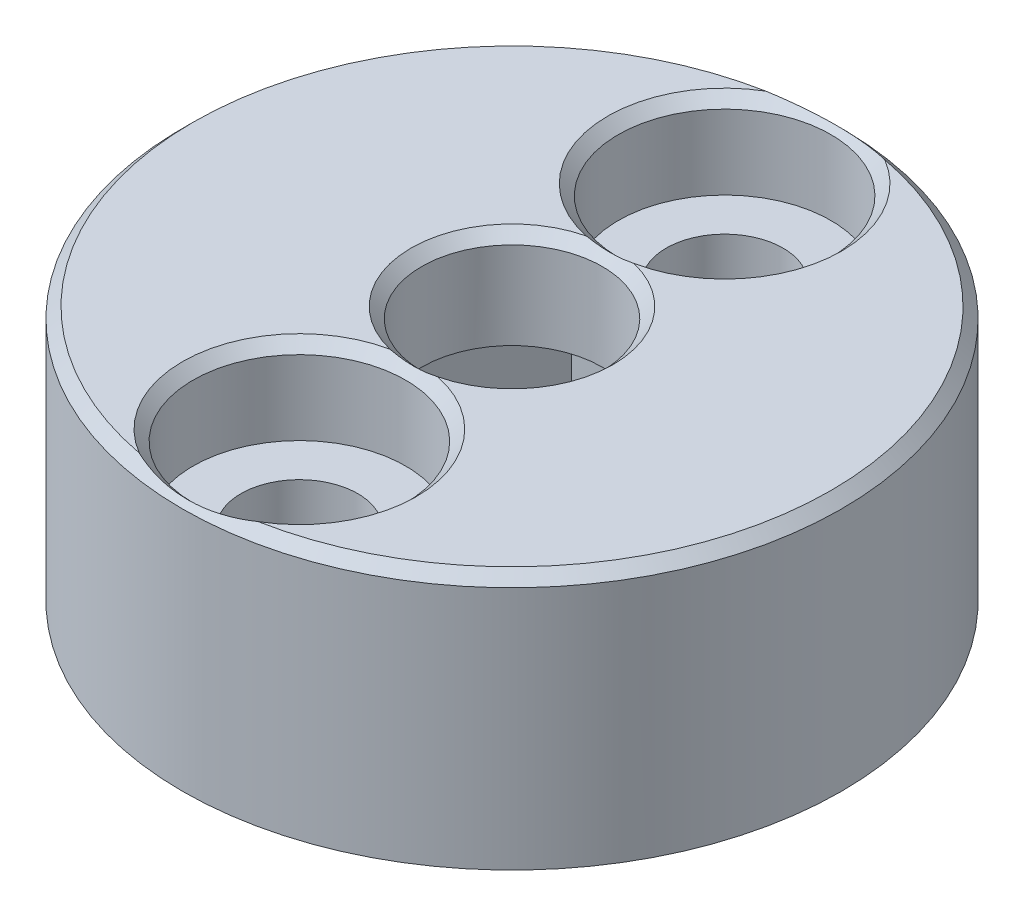
ISO-10303-21;
HEADER;
FILE_DESCRIPTION(('STEP AP214'),'2;1');
FILE_NAME('part.step','',(''),(''),'','','');
FILE_SCHEMA(('AUTOMOTIVE_DESIGN { 1 0 10303 214 1 1 1 1 }'));
ENDSEC;
DATA;
#1=APPLICATION_CONTEXT('core data for automotive mechanical design processes');
#2=APPLICATION_PROTOCOL_DEFINITION('international standard','automotive_design',2000,#1);
#3=PRODUCT_CONTEXT('',#1,'mechanical');
#4=PRODUCT('Part','Part','',(#3));
#5=PRODUCT_RELATED_PRODUCT_CATEGORY('part','',(#4));
#6=PRODUCT_DEFINITION_FORMATION('','',#4);
#7=PRODUCT_DEFINITION_CONTEXT('part definition',#1,'design');
#8=PRODUCT_DEFINITION('design','',#6,#7);
#9=PRODUCT_DEFINITION_SHAPE('','',#8);
#10=(LENGTH_UNIT() NAMED_UNIT(*) SI_UNIT(.MILLI.,.METRE.));
#11=(NAMED_UNIT(*) PLANE_ANGLE_UNIT() SI_UNIT($,.RADIAN.));
#12=(NAMED_UNIT(*) SI_UNIT($,.STERADIAN.) SOLID_ANGLE_UNIT());
#13=UNCERTAINTY_MEASURE_WITH_UNIT(LENGTH_MEASURE(1.E-05),#10,'distance_accuracy_value','');
#14=(GEOMETRIC_REPRESENTATION_CONTEXT(3) GLOBAL_UNCERTAINTY_ASSIGNED_CONTEXT((#13)) GLOBAL_UNIT_ASSIGNED_CONTEXT((#10,
#11,#12)) REPRESENTATION_CONTEXT('',''));
#15=CARTESIAN_POINT('',(0.,0.,0.));
#16=DIRECTION('',(0.,0.,1.));
#17=DIRECTION('',(1.,0.,0.));
#18=AXIS2_PLACEMENT_3D('',#15,#16,#17);
#19=CARTESIAN_POINT('',(0.,12.,0.));
#20=DIRECTION('',(0.,1.,0.));
#21=DIRECTION('',(0.,0.,1.));
#22=AXIS2_PLACEMENT_3D('',#19,#20,#21);
#23=PLANE('',#22);
#24=CARTESIAN_POINT('',(0.,12.,0.));
#25=DIRECTION('',(0.,1.,0.));
#26=DIRECTION('',(0.,0.,1.));
#27=AXIS2_PLACEMENT_3D('',#24,#25,#26);
#28=CIRCLE('',#27,15.);
#29=CARTESIAN_POINT('',(-2.79393875201302,12.,-14.7375));
#30=VERTEX_POINT('',#29);
#31=CARTESIAN_POINT('',(-2.79393875201257,12.,14.7375000000001));
#32=VERTEX_POINT('',#31);
#33=EDGE_CURVE('E249',#30,#32,#28,.T.);
#34=ORIENTED_EDGE('',*,*,#33,.T.);
#35=CARTESIAN_POINT('',(3.0964814046186E-13,12.,10.));
#36=DIRECTION('',(0.,1.,0.));
#37=DIRECTION('',(0.,0.,1.));
#38=AXIS2_PLACEMENT_3D('',#35,#36,#37);
#39=CIRCLE('',#38,5.50000000000001);
#40=CARTESIAN_POINT('',(-1.1218314754787,12.,4.61562500000003));
#41=VERTEX_POINT('',#40);
#42=EDGE_CURVE('E257',#32,#41,#39,.F.);
#43=ORIENTED_EDGE('',*,*,#42,.T.);
#44=CARTESIAN_POINT('',(0.,12.,0.));
#45=DIRECTION('',(0.,1.,0.));
#46=DIRECTION('',(0.,0.,1.));
#47=AXIS2_PLACEMENT_3D('',#44,#45,#46);
#48=CIRCLE('',#47,4.75);
#49=CARTESIAN_POINT('',(-1.12183147547885,12.,-4.615625));
#50=VERTEX_POINT('',#49);
#51=EDGE_CURVE('E70',#41,#50,#48,.F.);
#52=ORIENTED_EDGE('',*,*,#51,.T.);
#53=CARTESIAN_POINT('',(0.,12.,-10.));
#54=DIRECTION('',(0.,1.,0.));
#55=DIRECTION('',(0.,0.,1.));
#56=AXIS2_PLACEMENT_3D('',#53,#54,#55);
#57=CIRCLE('',#56,5.50000000000001);
#58=EDGE_CURVE('E252',#50,#30,#57,.F.);
#59=ORIENTED_EDGE('',*,*,#58,.T.);
#60=EDGE_LOOP('',(#34,#43,#52,#59));
#61=FACE_BOUND('',#60,.T.);
#62=ADVANCED_FACE('F41',(#61),#23,.T.);
#63=CARTESIAN_POINT('',(3.09883967416999E-13,0.,10.));
#64=DIRECTION('',(0.,1.,0.));
#65=DIRECTION('',(0.,0.,1.));
#66=AXIS2_PLACEMENT_3D('',#63,#64,#65);
#67=CYLINDRICAL_SURFACE('',#66,2.75);
#68=CARTESIAN_POINT('',(3.09883967416999E-13,0.,10.));
#69=DIRECTION('',(0.,1.,0.));
#70=DIRECTION('',(0.,0.,1.));
#71=AXIS2_PLACEMENT_3D('',#68,#69,#70);
#72=CIRCLE('',#71,2.75);
#73=CARTESIAN_POINT('',(3.09883967416999E-13,0.,12.75));
#74=VERTEX_POINT('',#73);
#75=EDGE_CURVE('E209',#74,#74,#72,.T.);
#76=ORIENTED_EDGE('',*,*,#75,.F.);
#77=EDGE_LOOP('',(#76));
#78=FACE_BOUND('',#77,.T.);
#79=CARTESIAN_POINT('',(3.09883967416999E-13,8.,10.));
#80=DIRECTION('',(0.,1.,0.));
#81=DIRECTION('',(0.,0.,1.));
#82=AXIS2_PLACEMENT_3D('',#79,#80,#81);
#83=CIRCLE('',#82,2.75);
#84=CARTESIAN_POINT('',(3.09883967416999E-13,8.,12.75));
#85=VERTEX_POINT('',#84);
#86=EDGE_CURVE('E228',#85,#85,#83,.F.);
#87=ORIENTED_EDGE('',*,*,#86,.F.);
#88=EDGE_LOOP('',(#87));
#89=FACE_BOUND('',#88,.T.);
#90=ADVANCED_FACE('F334',(#78,#89),#67,.F.);
#91=CARTESIAN_POINT('',(0.,0.,-10.));
#92=DIRECTION('',(0.,1.,0.));
#93=DIRECTION('',(0.,0.,1.));
#94=AXIS2_PLACEMENT_3D('',#91,#92,#93);
#95=CYLINDRICAL_SURFACE('',#94,2.75);
#96=CARTESIAN_POINT('',(0.,0.,-10.));
#97=DIRECTION('',(0.,1.,0.));
#98=DIRECTION('',(0.,0.,1.));
#99=AXIS2_PLACEMENT_3D('',#96,#97,#98);
#100=CIRCLE('',#99,2.75);
#101=CARTESIAN_POINT('',(0.,0.,-7.25));
#102=VERTEX_POINT('',#101);
#103=EDGE_CURVE('E213',#102,#102,#100,.T.);
#104=ORIENTED_EDGE('',*,*,#103,.F.);
#105=EDGE_LOOP('',(#104));
#106=FACE_BOUND('',#105,.T.);
#107=CARTESIAN_POINT('',(0.,8.,-10.));
#108=DIRECTION('',(0.,1.,0.));
#109=DIRECTION('',(0.,0.,1.));
#110=AXIS2_PLACEMENT_3D('',#107,#108,#109);
#111=CIRCLE('',#110,2.75);
#112=CARTESIAN_POINT('',(0.,8.,-7.25));
#113=VERTEX_POINT('',#112);
#114=EDGE_CURVE('E180',#113,#113,#111,.F.);
#115=ORIENTED_EDGE('',*,*,#114,.F.);
#116=EDGE_LOOP('',(#115));
#117=FACE_BOUND('',#116,.T.);
#118=ADVANCED_FACE('F339',(#106,#117),#95,.F.);
#119=CARTESIAN_POINT('',(0.,0.,0.));
#120=DIRECTION('',(0.,1.,0.));
#121=DIRECTION('',(0.,0.,1.));
#122=AXIS2_PLACEMENT_3D('',#119,#120,#121);
#123=CYLINDRICAL_SURFACE('',#122,4.25);
#124=CARTESIAN_POINT('',(0.,11.5,0.));
#125=DIRECTION('',(0.,1.,0.));
#126=DIRECTION('',(0.,0.,1.));
#127=AXIS2_PLACEMENT_3D('',#124,#125,#126);
#128=CIRCLE('',#127,4.25);
#129=CARTESIAN_POINT('',(0.,11.5,4.25));
#130=VERTEX_POINT('',#129);
#131=EDGE_CURVE('E260',#130,#130,#128,.T.);
#132=ORIENTED_EDGE('',*,*,#131,.T.);
#133=EDGE_LOOP('',(#132));
#134=FACE_BOUND('',#133,.T.);
#135=CARTESIAN_POINT('',(0.,7.4,0.));
#136=DIRECTION('',(0.,-1.,0.));
#137=DIRECTION('',(0.,0.,-1.));
#138=AXIS2_PLACEMENT_3D('',#135,#136,#137);
#139=CIRCLE('',#138,4.25);
#140=CARTESIAN_POINT('',(0.,7.4,-4.25));
#141=VERTEX_POINT('',#140);
#142=EDGE_CURVE('E197',#141,#141,#139,.F.);
#143=ORIENTED_EDGE('',*,*,#142,.F.);
#144=EDGE_LOOP('',(#143));
#145=FACE_BOUND('',#144,.T.);
#146=ADVANCED_FACE('F352',(#134,#145),#123,.F.);
#147=CARTESIAN_POINT('',(0.,12.,0.));
#148=DIRECTION('',(0.,-1.,0.));
#149=DIRECTION('',(0.,0.,-1.));
#150=AXIS2_PLACEMENT_3D('',#147,#148,#149);
#151=CYLINDRICAL_SURFACE('',#150,15.5);
#152=CARTESIAN_POINT('',(0.,11.5,0.));
#153=DIRECTION('',(0.,1.,0.));
#154=DIRECTION('',(0.,0.,1.));
#155=AXIS2_PLACEMENT_3D('',#152,#153,#154);
#156=CIRCLE('',#155,15.5);
#157=CARTESIAN_POINT('',(0.,11.5,15.5));
#158=VERTEX_POINT('',#157);
#159=EDGE_CURVE('E12',#158,#158,#156,.F.);
#160=ORIENTED_EDGE('',*,*,#159,.T.);
#161=EDGE_LOOP('',(#160));
#162=FACE_BOUND('',#161,.T.);
#163=CARTESIAN_POINT('',(0.,0.,0.));
#164=DIRECTION('',(0.,1.,0.));
#165=DIRECTION('',(0.,0.,1.));
#166=AXIS2_PLACEMENT_3D('',#163,#164,#165);
#167=CIRCLE('',#166,15.5);
#168=CARTESIAN_POINT('',(0.,0.,15.5));
#169=VERTEX_POINT('',#168);
#170=EDGE_CURVE('E217',#169,#169,#167,.T.);
#171=ORIENTED_EDGE('',*,*,#170,.T.);
#172=EDGE_LOOP('',(#171));
#173=FACE_BOUND('',#172,.T.);
#174=ADVANCED_FACE('F346',(#162,#173),#151,.T.);
#175=CARTESIAN_POINT('',(0.,12.,0.));
#176=DIRECTION('',(0.,1.,0.));
#177=DIRECTION('',(0.,0.,1.));
#178=AXIS2_PLACEMENT_3D('',#175,#176,#177);
#179=CIRCLE('',#178,4.75);
#180=CARTESIAN_POINT('',(1.12183147547885,12.,-4.615625));
#181=VERTEX_POINT('',#180);
#182=CARTESIAN_POINT('',(1.12183147547899,12.,4.61562499999996));
#183=VERTEX_POINT('',#182);
#184=EDGE_CURVE('E242',#181,#183,#179,.F.);
#185=ORIENTED_EDGE('',*,*,#184,.T.);
#186=CARTESIAN_POINT('',(3.0964814046186E-13,12.,10.));
#187=DIRECTION('',(0.,1.,0.));
#188=DIRECTION('',(0.,0.,1.));
#189=AXIS2_PLACEMENT_3D('',#186,#187,#188);
#190=CIRCLE('',#189,5.50000000000001);
#191=CARTESIAN_POINT('',(2.79393875201348,12.,14.7374999999999));
#192=VERTEX_POINT('',#191);
#193=EDGE_CURVE('E245',#183,#192,#190,.F.);
#194=ORIENTED_EDGE('',*,*,#193,.T.);
#195=CARTESIAN_POINT('',(0.,12.,0.));
#196=DIRECTION('',(0.,1.,0.));
#197=DIRECTION('',(0.,0.,1.));
#198=AXIS2_PLACEMENT_3D('',#195,#196,#197);
#199=CIRCLE('',#198,15.);
#200=CARTESIAN_POINT('',(2.79393875201302,12.,-14.7375));
#201=VERTEX_POINT('',#200);
#202=EDGE_CURVE('E236',#192,#201,#199,.T.);
#203=ORIENTED_EDGE('',*,*,#202,.T.);
#204=CARTESIAN_POINT('',(0.,12.,-10.));
#205=DIRECTION('',(0.,1.,0.));
#206=DIRECTION('',(0.,0.,1.));
#207=AXIS2_PLACEMENT_3D('',#204,#205,#206);
#208=CIRCLE('',#207,5.50000000000001);
#209=EDGE_CURVE('E239',#201,#181,#208,.F.);
#210=ORIENTED_EDGE('',*,*,#209,.T.);
#211=EDGE_LOOP('',(#185,#194,#203,#210));
#212=FACE_BOUND('',#211,.T.);
#213=ADVANCED_FACE('F321',(#212),#23,.T.);
#214=CARTESIAN_POINT('',(0.,0.,0.));
#215=DIRECTION('',(0.,1.,0.));
#216=DIRECTION('',(0.,0.,1.));
#217=AXIS2_PLACEMENT_3D('',#214,#215,#216);
#218=PLANE('',#217);
#219=DIRECTION('',(0.497709547995986,0.,0.867343764509569));
#220=VECTOR('',#219,1.);
#221=CARTESIAN_POINT('',(3.79894120062275,0.,-6.53998311064672));
#222=LINE('',#221,#220);
#223=CARTESIAN_POINT('',(3.79894120062275,0.,-6.53998311064672));
#224=VERTEX_POINT('',#223);
#225=CARTESIAN_POINT('',(7.5632621144526,0.,0.0199880318992981));
#226=VERTEX_POINT('',#225);
#227=EDGE_CURVE('E179',#224,#226,#222,.T.);
#228=ORIENTED_EDGE('',*,*,#227,.F.);
#229=DIRECTION('',(0.999996507877308,0.,0.00264276998419005));
#230=VECTOR('',#229,1.);
#231=CARTESIAN_POINT('',(-3.76432091382986,0.,-6.55997114254601));
#232=LINE('',#231,#230);
#233=CARTESIAN_POINT('',(-3.76432091382986,0.,-6.55997114254601));
#234=VERTEX_POINT('',#233);
#235=EDGE_CURVE('E134',#234,#224,#232,.T.);
#236=ORIENTED_EDGE('',*,*,#235,.F.);
#237=DIRECTION('',(0.502286959881321,0.,-0.864700994525379));
#238=VECTOR('',#237,1.);
#239=CARTESIAN_POINT('',(-7.5632621144526,0.,-0.019988031899296));
#240=LINE('',#239,#238);
#241=CARTESIAN_POINT('',(-7.5632621144526,0.,-0.019988031899296));
#242=VERTEX_POINT('',#241);
#243=EDGE_CURVE('E156',#242,#234,#240,.T.);
#244=ORIENTED_EDGE('',*,*,#243,.F.);
#245=DIRECTION('',(-0.497709547995986,0.,-0.867343764509569));
#246=VECTOR('',#245,1.);
#247=CARTESIAN_POINT('',(-3.79894120062275,0.,6.53998311064672));
#248=LINE('',#247,#246);
#249=CARTESIAN_POINT('',(-3.79894120062275,0.,6.53998311064672));
#250=VERTEX_POINT('',#249);
#251=EDGE_CURVE('E160',#250,#242,#248,.T.);
#252=ORIENTED_EDGE('',*,*,#251,.F.);
#253=DIRECTION('',(-0.999996507877308,0.,-0.00264276998418993));
#254=VECTOR('',#253,1.);
#255=CARTESIAN_POINT('',(3.76432091382986,0.,6.55997114254601));
#256=LINE('',#255,#254);
#257=CARTESIAN_POINT('',(3.76432091382986,0.,6.55997114254601));
#258=VERTEX_POINT('',#257);
#259=EDGE_CURVE('E187',#258,#250,#256,.T.);
#260=ORIENTED_EDGE('',*,*,#259,.F.);
#261=DIRECTION('',(-0.502286959881321,0.,0.864700994525379));
#262=VECTOR('',#261,1.);
#263=CARTESIAN_POINT('',(7.5632621144526,0.,0.0199880318992981));
#264=LINE('',#263,#262);
#265=EDGE_CURVE('E183',#226,#258,#264,.T.);
#266=ORIENTED_EDGE('',*,*,#265,.F.);
#267=EDGE_LOOP('',(#228,#236,#244,#252,#260,#266));
#268=FACE_BOUND('',#267,.T.);
#269=ORIENTED_EDGE('',*,*,#75,.T.);
#270=EDGE_LOOP('',(#269));
#271=FACE_BOUND('',#270,.T.);
#272=ORIENTED_EDGE('',*,*,#103,.T.);
#273=EDGE_LOOP('',(#272));
#274=FACE_BOUND('',#273,.T.);
#275=ORIENTED_EDGE('',*,*,#170,.F.);
#276=EDGE_LOOP('',(#275));
#277=FACE_BOUND('',#276,.T.);
#278=ADVANCED_FACE('F345',(#268,#271,#274,#277),#218,.F.);
#279=CARTESIAN_POINT('',(0.,7.4,0.));
#280=DIRECTION('',(0.,-1.,0.));
#281=DIRECTION('',(0.,0.,-1.));
#282=AXIS2_PLACEMENT_3D('',#279,#280,#281);
#283=PLANE('',#282);
#284=DIRECTION('',(0.999996507877308,0.,0.00264276998419005));
#285=VECTOR('',#284,1.);
#286=CARTESIAN_POINT('',(-3.76432091382986,7.4,-6.55997114254601));
#287=LINE('',#286,#285);
#288=CARTESIAN_POINT('',(-3.76432091382986,7.4,-6.55997114254601));
#289=VERTEX_POINT('',#288);
#290=CARTESIAN_POINT('',(3.79894120062275,7.4,-6.53998311064672));
#291=VERTEX_POINT('',#290);
#292=EDGE_CURVE('E131',#289,#291,#287,.T.);
#293=ORIENTED_EDGE('',*,*,#292,.T.);
#294=DIRECTION('',(0.497709547995986,0.,0.867343764509569));
#295=VECTOR('',#294,1.);
#296=CARTESIAN_POINT('',(3.79894120062275,7.4,-6.53998311064672));
#297=LINE('',#296,#295);
#298=CARTESIAN_POINT('',(7.5632621144526,7.4,0.0199880318992981));
#299=VERTEX_POINT('',#298);
#300=EDGE_CURVE('E143',#291,#299,#297,.T.);
#301=ORIENTED_EDGE('',*,*,#300,.T.);
#302=DIRECTION('',(-0.502286959881321,0.,0.864700994525379));
#303=VECTOR('',#302,1.);
#304=CARTESIAN_POINT('',(7.5632621144526,7.4,0.0199880318992981));
#305=LINE('',#304,#303);
#306=CARTESIAN_POINT('',(3.76432091382986,7.4,6.55997114254601));
#307=VERTEX_POINT('',#306);
#308=EDGE_CURVE('E149',#299,#307,#305,.T.);
#309=ORIENTED_EDGE('',*,*,#308,.T.);
#310=DIRECTION('',(-0.999996507877308,0.,-0.00264276998418993));
#311=VECTOR('',#310,1.);
#312=CARTESIAN_POINT('',(3.76432091382986,7.4,6.55997114254601));
#313=LINE('',#312,#311);
#314=CARTESIAN_POINT('',(-3.79894120062275,7.4,6.53998311064672));
#315=VERTEX_POINT('',#314);
#316=EDGE_CURVE('E168',#307,#315,#313,.T.);
#317=ORIENTED_EDGE('',*,*,#316,.T.);
#318=DIRECTION('',(-0.497709547995986,0.,-0.867343764509569));
#319=VECTOR('',#318,1.);
#320=CARTESIAN_POINT('',(-3.79894120062275,7.4,6.53998311064672));
#321=LINE('',#320,#319);
#322=CARTESIAN_POINT('',(-7.5632621144526,7.4,-0.019988031899296));
#323=VERTEX_POINT('',#322);
#324=EDGE_CURVE('E172',#315,#323,#321,.T.);
#325=ORIENTED_EDGE('',*,*,#324,.T.);
#326=DIRECTION('',(0.502286959881321,0.,-0.864700994525379));
#327=VECTOR('',#326,1.);
#328=CARTESIAN_POINT('',(-7.5632621144526,7.4,-0.019988031899296));
#329=LINE('',#328,#327);
#330=EDGE_CURVE('E140',#323,#289,#329,.T.);
#331=ORIENTED_EDGE('',*,*,#330,.T.);
#332=EDGE_LOOP('',(#293,#301,#309,#317,#325,#331));
#333=FACE_BOUND('',#332,.T.);
#334=ORIENTED_EDGE('',*,*,#142,.T.);
#335=EDGE_LOOP('',(#334));
#336=FACE_BOUND('',#335,.T.);
#337=ADVANCED_FACE('F151',(#333,#336),#283,.T.);
#338=CARTESIAN_POINT('',(-3.76432091382986,7.4,-6.55997114254601));
#339=DIRECTION('',(0.00264276998419005,0.,-0.999996507877308));
#340=DIRECTION('',(-0.999996507877308,0.,-0.00264276998419005));
#341=AXIS2_PLACEMENT_3D('',#338,#339,#340);
#342=PLANE('',#341);
#343=ORIENTED_EDGE('',*,*,#235,.T.);
#344=DIRECTION('',(0.,-1.,0.));
#345=VECTOR('',#344,1.);
#346=CARTESIAN_POINT('',(3.79894120062275,7.4,-6.53998311064672));
#347=LINE('',#346,#345);
#348=EDGE_CURVE('E127',#291,#224,#347,.T.);
#349=ORIENTED_EDGE('',*,*,#348,.F.);
#350=ORIENTED_EDGE('',*,*,#292,.F.);
#351=DIRECTION('',(0.,-1.,0.));
#352=VECTOR('',#351,1.);
#353=CARTESIAN_POINT('',(-3.76432091382986,7.4,-6.55997114254601));
#354=LINE('',#353,#352);
#355=EDGE_CURVE('E194',#289,#234,#354,.T.);
#356=ORIENTED_EDGE('',*,*,#355,.T.);
#357=EDGE_LOOP('',(#343,#349,#350,#356));
#358=FACE_BOUND('',#357,.T.);
#359=ADVANCED_FACE('F129',(#358),#342,.F.);
#360=CARTESIAN_POINT('',(-7.5632621144526,7.4,-0.019988031899296));
#361=DIRECTION('',(-0.864700994525379,0.,-0.502286959881321));
#362=DIRECTION('',(-0.502286959881321,0.,0.864700994525379));
#363=AXIS2_PLACEMENT_3D('',#360,#361,#362);
#364=PLANE('',#363);
#365=ORIENTED_EDGE('',*,*,#243,.T.);
#366=ORIENTED_EDGE('',*,*,#355,.F.);
#367=ORIENTED_EDGE('',*,*,#330,.F.);
#368=DIRECTION('',(0.,-1.,0.));
#369=VECTOR('',#368,1.);
#370=CARTESIAN_POINT('',(-7.5632621144526,7.4,-0.019988031899296));
#371=LINE('',#370,#369);
#372=EDGE_CURVE('E198',#323,#242,#371,.T.);
#373=ORIENTED_EDGE('',*,*,#372,.T.);
#374=EDGE_LOOP('',(#365,#366,#367,#373));
#375=FACE_BOUND('',#374,.T.);
#376=ADVANCED_FACE('F371',(#375),#364,.F.);
#377=CARTESIAN_POINT('',(-3.79894120062275,7.4,6.53998311064672));
#378=DIRECTION('',(-0.867343764509569,0.,0.497709547995986));
#379=DIRECTION('',(0.497709547995986,0.,0.867343764509569));
#380=AXIS2_PLACEMENT_3D('',#377,#378,#379);
#381=PLANE('',#380);
#382=ORIENTED_EDGE('',*,*,#251,.T.);
#383=ORIENTED_EDGE('',*,*,#372,.F.);
#384=ORIENTED_EDGE('',*,*,#324,.F.);
#385=DIRECTION('',(0.,-1.,0.));
#386=VECTOR('',#385,1.);
#387=CARTESIAN_POINT('',(-3.79894120062275,7.4,6.53998311064672));
#388=LINE('',#387,#386);
#389=EDGE_CURVE('E201',#315,#250,#388,.T.);
#390=ORIENTED_EDGE('',*,*,#389,.T.);
#391=EDGE_LOOP('',(#382,#383,#384,#390));
#392=FACE_BOUND('',#391,.T.);
#393=ADVANCED_FACE('F382',(#392),#381,.F.);
#394=CARTESIAN_POINT('',(3.76432091382986,7.4,6.55997114254601));
#395=DIRECTION('',(-0.00264276998418993,0.,0.999996507877308));
#396=DIRECTION('',(0.999996507877308,0.,0.00264276998418993));
#397=AXIS2_PLACEMENT_3D('',#394,#395,#396);
#398=PLANE('',#397);
#399=ORIENTED_EDGE('',*,*,#259,.T.);
#400=ORIENTED_EDGE('',*,*,#389,.F.);
#401=ORIENTED_EDGE('',*,*,#316,.F.);
#402=DIRECTION('',(0.,-1.,0.));
#403=VECTOR('',#402,1.);
#404=CARTESIAN_POINT('',(3.76432091382986,7.4,6.55997114254601));
#405=LINE('',#404,#403);
#406=EDGE_CURVE('E204',#307,#258,#405,.T.);
#407=ORIENTED_EDGE('',*,*,#406,.T.);
#408=EDGE_LOOP('',(#399,#400,#401,#407));
#409=FACE_BOUND('',#408,.T.);
#410=ADVANCED_FACE('F378',(#409),#398,.F.);
#411=CARTESIAN_POINT('',(7.5632621144526,7.4,0.0199880318992981));
#412=DIRECTION('',(0.864700994525379,0.,0.502286959881321));
#413=DIRECTION('',(0.502286959881321,0.,-0.864700994525379));
#414=AXIS2_PLACEMENT_3D('',#411,#412,#413);
#415=PLANE('',#414);
#416=ORIENTED_EDGE('',*,*,#265,.T.);
#417=ORIENTED_EDGE('',*,*,#406,.F.);
#418=ORIENTED_EDGE('',*,*,#308,.F.);
#419=DIRECTION('',(0.,-1.,0.));
#420=VECTOR('',#419,1.);
#421=CARTESIAN_POINT('',(7.5632621144526,7.4,0.0199880318992981));
#422=LINE('',#421,#420);
#423=EDGE_CURVE('E139',#299,#226,#422,.T.);
#424=ORIENTED_EDGE('',*,*,#423,.T.);
#425=EDGE_LOOP('',(#416,#417,#418,#424));
#426=FACE_BOUND('',#425,.T.);
#427=ADVANCED_FACE('F375',(#426),#415,.F.);
#428=CARTESIAN_POINT('',(3.79894120062275,7.4,-6.53998311064672));
#429=DIRECTION('',(0.867343764509569,0.,-0.497709547995986));
#430=DIRECTION('',(-0.497709547995986,0.,-0.867343764509569));
#431=AXIS2_PLACEMENT_3D('',#428,#429,#430);
#432=PLANE('',#431);
#433=ORIENTED_EDGE('',*,*,#227,.T.);
#434=ORIENTED_EDGE('',*,*,#423,.F.);
#435=ORIENTED_EDGE('',*,*,#300,.F.);
#436=ORIENTED_EDGE('',*,*,#348,.T.);
#437=EDGE_LOOP('',(#433,#434,#435,#436));
#438=FACE_BOUND('',#437,.T.);
#439=ADVANCED_FACE('F144',(#438),#432,.F.);
#440=CARTESIAN_POINT('',(0.,8.,0.));
#441=DIRECTION('',(0.,1.,0.));
#442=DIRECTION('',(0.,0.,1.));
#443=AXIS2_PLACEMENT_3D('',#440,#441,#442);
#444=PLANE('',#443);
#445=CARTESIAN_POINT('',(0.,8.,-10.));
#446=DIRECTION('',(0.,1.,0.));
#447=DIRECTION('',(0.,0.,1.));
#448=AXIS2_PLACEMENT_3D('',#445,#446,#447);
#449=CIRCLE('',#448,5.);
#450=CARTESIAN_POINT('',(0.,8.,-5.));
#451=VERTEX_POINT('',#450);
#452=EDGE_CURVE('E163',#451,#451,#449,.F.);
#453=ORIENTED_EDGE('',*,*,#452,.F.);
#454=EDGE_LOOP('',(#453));
#455=FACE_BOUND('',#454,.T.);
#456=ORIENTED_EDGE('',*,*,#114,.T.);
#457=EDGE_LOOP('',(#456));
#458=FACE_BOUND('',#457,.T.);
#459=ADVANCED_FACE('F374',(#455,#458),#444,.T.);
#460=CARTESIAN_POINT('',(0.,-14.142135623731,-10.));
#461=DIRECTION('',(0.,1.,0.));
#462=DIRECTION('',(0.,0.,1.));
#463=AXIS2_PLACEMENT_3D('',#460,#461,#462);
#464=CYLINDRICAL_SURFACE('',#463,5.);
#465=CARTESIAN_POINT('',(0.,11.5,-10.));
#466=DIRECTION('',(0.,1.,0.));
#467=DIRECTION('',(0.,0.,1.));
#468=AXIS2_PLACEMENT_3D('',#465,#466,#467);
#469=CIRCLE('',#468,5.);
#470=CARTESIAN_POINT('',(0.,11.5,-5.));
#471=VERTEX_POINT('',#470);
#472=EDGE_CURVE('E55',#471,#471,#469,.T.);
#473=ORIENTED_EDGE('',*,*,#472,.T.);
#474=EDGE_LOOP('',(#473));
#475=FACE_BOUND('',#474,.T.);
#476=ORIENTED_EDGE('',*,*,#452,.T.);
#477=EDGE_LOOP('',(#476));
#478=FACE_BOUND('',#477,.T.);
#479=ADVANCED_FACE('F392',(#475,#478),#464,.F.);
#480=CARTESIAN_POINT('',(0.,8.,0.));
#481=DIRECTION('',(0.,1.,0.));
#482=DIRECTION('',(0.,0.,1.));
#483=AXIS2_PLACEMENT_3D('',#480,#481,#482);
#484=PLANE('',#483);
#485=CARTESIAN_POINT('',(3.0964814046186E-13,8.,10.));
#486=DIRECTION('',(0.,1.,0.));
#487=DIRECTION('',(0.,0.,1.));
#488=AXIS2_PLACEMENT_3D('',#485,#486,#487);
#489=CIRCLE('',#488,5.);
#490=CARTESIAN_POINT('',(3.0964814046186E-13,8.,15.));
#491=VERTEX_POINT('',#490);
#492=EDGE_CURVE('E232',#491,#491,#489,.F.);
#493=ORIENTED_EDGE('',*,*,#492,.F.);
#494=EDGE_LOOP('',(#493));
#495=FACE_BOUND('',#494,.T.);
#496=ORIENTED_EDGE('',*,*,#86,.T.);
#497=EDGE_LOOP('',(#496));
#498=FACE_BOUND('',#497,.T.);
#499=ADVANCED_FACE('F329',(#495,#498),#484,.T.);
#500=CARTESIAN_POINT('',(3.0964814046186E-13,-14.142135623731,10.));
#501=DIRECTION('',(0.,1.,0.));
#502=DIRECTION('',(0.,0.,1.));
#503=AXIS2_PLACEMENT_3D('',#500,#501,#502);
#504=CYLINDRICAL_SURFACE('',#503,5.);
#505=CARTESIAN_POINT('',(3.0964814046186E-13,11.5,10.));
#506=DIRECTION('',(0.,1.,0.));
#507=DIRECTION('',(0.,0.,1.));
#508=AXIS2_PLACEMENT_3D('',#505,#506,#507);
#509=CIRCLE('',#508,5.);
#510=CARTESIAN_POINT('',(3.0964814046186E-13,11.5,15.));
#511=VERTEX_POINT('',#510);
#512=EDGE_CURVE('E221',#511,#511,#509,.T.);
#513=ORIENTED_EDGE('',*,*,#512,.T.);
#514=EDGE_LOOP('',(#513));
#515=FACE_BOUND('',#514,.T.);
#516=ORIENTED_EDGE('',*,*,#492,.T.);
#517=EDGE_LOOP('',(#516));
#518=FACE_BOUND('',#517,.T.);
#519=ADVANCED_FACE('F324',(#515,#518),#504,.F.);
#520=CARTESIAN_POINT('',(0.,11.5,-10.));
#521=DIRECTION('',(0.,1.,0.));
#522=DIRECTION('',(0.,0.,1.));
#523=AXIS2_PLACEMENT_3D('',#520,#521,#522);
#524=CONICAL_SURFACE('',#523,5.,0.785398163397452);
#525=ORIENTED_EDGE('',*,*,#472,.F.);
#526=EDGE_LOOP('',(#525));
#527=FACE_BOUND('',#526,.T.);
#528=CARTESIAN_POINT('',(1.12273967058321,12.0002000000001,-4.61560999999999));
#529=CARTESIAN_POINT('',(1.05129019127414,11.984457657265,-4.61679067579257));
#530=CARTESIAN_POINT('',(0.979541920620625,11.9700841639824,-4.61786868776077));
#531=CARTESIAN_POINT('',(0.835513854295343,11.944219228167,-4.61980855782632));
#532=CARTESIAN_POINT('',(0.763233975132501,11.9327282487414,-4.62067038119062));
#533=CARTESIAN_POINT('',(0.545691458785016,11.9027972492275,-4.62291520602884));
#534=CARTESIAN_POINT('',(0.399764632581172,11.8889078328765,-4.62395691237513));
#535=CARTESIAN_POINT('',(0.109938077034888,11.8741466295685,-4.62506400275452));
#536=CARTESIAN_POINT('',(-0.0339499479287141,11.8730415328256,-4.62514688502351));
#537=CARTESIAN_POINT('',(-0.321193818852279,11.8832984849953,-4.62437761363596));
#538=CARTESIAN_POINT('',(-0.464549955642974,11.8946522231533,-4.62352608328603));
#539=CARTESIAN_POINT('',(-0.693496067775447,11.9224002841744,-4.62144497867328));
#540=CARTESIAN_POINT('',(-0.779566762287709,11.935039748719,-4.62049701880617));
#541=CARTESIAN_POINT('',(-0.951485768523884,11.9645165655291,-4.61828625752569));
#542=CARTESIAN_POINT('',(-1.0373300618665,11.9813772809499,-4.61702170387585));
#543=CARTESIAN_POINT('',(-1.12273967058321,12.0002000000001,-4.61560999999999));
#544=B_SPLINE_CURVE_WITH_KNOTS('',3,(#528,#529,#530,#531,#532,#533,#534,#535,#536,#537,#538,
#539,#540,#541,#542,#543),.UNSPECIFIED.,.F.,.F.,(4,2,2,2,2,2,2,4),(0.,0.219492856492662,
0.439020954351156,0.878195747883504,1.30934281988415,1.74020246688399,2.00110760384439,
2.26348998015911),.UNSPECIFIED.);
#545=EDGE_CURVE('E300',#181,#50,#544,.T.);
#546=ORIENTED_EDGE('',*,*,#545,.F.);
#547=ORIENTED_EDGE('',*,*,#209,.F.);
#548=CARTESIAN_POINT('',(4.06760714607575,12.2965081070408,-14.1296583805665));
#549=CARTESIAN_POINT('',(3.880339575114,12.2430820427832,-14.2391818126747));
#550=CARTESIAN_POINT('',(3.68812890215291,12.1929306155336,-14.3419922385685));
#551=CARTESIAN_POINT('',(3.29472494491819,12.0997724110111,-14.5329665576816));
#552=CARTESIAN_POINT('',(3.09352495625068,12.0567710831929,-14.6211192795187));
#553=CARTESIAN_POINT('',(2.68296445928171,11.9785211404789,-14.781531661954));
#554=CARTESIAN_POINT('',(2.47358992564845,11.9432866073334,-14.853762454965));
#555=CARTESIAN_POINT('',(2.04848730856339,11.8812485951748,-14.980940379937));
#556=CARTESIAN_POINT('',(1.83276105763555,11.8544427099936,-15.0358924445427));
#557=CARTESIAN_POINT('',(1.40163583785926,11.8102435261563,-15.1265007713505));
#558=CARTESIAN_POINT('',(1.18634626705934,11.7926455440414,-15.1625766346436));
#559=CARTESIAN_POINT('',(0.752952507397268,11.7662457376679,-15.2166962378526));
#560=CARTESIAN_POINT('',(0.534848117806519,11.7574445442705,-15.2347386845033));
#561=CARTESIAN_POINT('',(0.0981318460358013,11.748812893266,-15.2524335690592));
#562=CARTESIAN_POINT('',(-0.120478287847777,11.7489654450888,-15.252120837634));
#563=CARTESIAN_POINT('',(-0.556695290694935,11.7581965896524,-15.2331969911469));
#564=CARTESIAN_POINT('',(-0.774302265534657,11.7672742176937,-15.2145878537191));
#565=CARTESIAN_POINT('',(-1.18714953779328,11.7929683089774,-15.1619149666043));
#566=CARTESIAN_POINT('',(-1.38263679111972,11.8088308810984,-15.1293966937247));
#567=CARTESIAN_POINT('',(-1.76996462612133,11.8475661358001,-15.0499894216407));
#568=CARTESIAN_POINT('',(-1.96180513327588,11.870438961471,-15.0031001291016));
#569=CARTESIAN_POINT('',(-2.34070666765514,11.9228809432551,-14.8955940664585));
#570=CARTESIAN_POINT('',(-2.52776633413325,11.9524519827385,-14.8349734354456));
#571=CARTESIAN_POINT('',(-2.89599254982666,12.0178935805165,-14.7008181598871));
#572=CARTESIAN_POINT('',(-3.07716083958764,12.0537622578267,-14.6272873713596));
#573=CARTESIAN_POINT('',(-3.39496956439048,12.1231167578421,-14.485110646499));
#574=CARTESIAN_POINT('',(-3.53288628762195,12.155487262325,-14.4187511124699));
#575=CARTESIAN_POINT('',(-3.80385317592853,12.2235500312018,-14.2792224363944));
#576=CARTESIAN_POINT('',(-3.93691642918155,12.2592322735504,-14.2060738395418));
#577=CARTESIAN_POINT('',(-4.06760714607575,12.2965081070408,-14.1296583805665));
#578=B_SPLINE_CURVE_WITH_KNOTS('',3,(#548,#549,#550,#551,#552,#553,#554,#555,#556,#557,#558,
#559,#560,#561,#562,#563,#564,#565,#566,#567,#568,#569,#570,#571,#572,#573,#574,#575,#576,#577),
.UNSPECIFIED.,.F.,.F.,(4,2,2,2,2,2,2,2,2,2,2,2,2,2,4),(0.,0.670202124051281,1.34091272490834,
2.01282954820247,2.68455438153745,3.34063437516697,3.99676141615708,4.65164343496406,
5.30645467623482,5.90219964286843,6.49795677038835,7.09388161830575,7.68962877668205,
8.15868799426727,8.62637134672687),.UNSPECIFIED.);
#579=EDGE_CURVE('E45',#30,#201,#578,.F.);
#580=ORIENTED_EDGE('',*,*,#579,.F.);
#581=ORIENTED_EDGE('',*,*,#58,.F.);
#582=EDGE_LOOP('',(#546,#547,#580,#581));
#583=FACE_BOUND('',#582,.T.);
#584=ADVANCED_FACE('F294',(#527,#583),#524,.F.);
#585=CARTESIAN_POINT('',(0.,12.,0.));
#586=DIRECTION('',(0.,-1.,0.));
#587=DIRECTION('',(0.,0.,-1.));
#588=AXIS2_PLACEMENT_3D('',#585,#586,#587);
#589=CONICAL_SURFACE('',#588,15.,0.78539816339745);
#590=ORIENTED_EDGE('',*,*,#159,.F.);
#591=EDGE_LOOP('',(#590));
#592=FACE_BOUND('',#591,.T.);
#593=ORIENTED_EDGE('',*,*,#579,.T.);
#594=ORIENTED_EDGE('',*,*,#202,.F.);
#595=CARTESIAN_POINT('',(-2.79502743669853,12.0002,14.7370900000001));
#596=CARTESIAN_POINT('',(-2.60379254015972,11.9650415370327,14.8091648492759));
#597=CARTESIAN_POINT('',(-2.40923711579508,11.9333081670319,14.8742182577942));
#598=CARTESIAN_POINT('',(-2.01468775886012,11.8770684112105,14.9895097571483));
#599=CARTESIAN_POINT('',(-1.81469172018993,11.8525648688701,15.0397420188496));
#600=CARTESIAN_POINT('',(-1.41072542628038,11.811201009089,15.1245379313345));
#601=CARTESIAN_POINT('',(-1.20675738390018,11.7943365560693,15.1591100600549));
#602=CARTESIAN_POINT('',(-0.79627222738426,11.7685014306392,15.2120720672044));
#603=CARTESIAN_POINT('',(-0.589755635647478,11.7595291668797,15.2304652078992));
#604=CARTESIAN_POINT('',(-0.178169840978673,11.7496820015438,15.2506518968327));
#605=CARTESIAN_POINT('',(0.0268875921104336,11.7487125851993,15.2526392003459));
#606=CARTESIAN_POINT('',(0.436410459455064,11.7546391878327,15.2404896649388));
#607=CARTESIAN_POINT('',(0.640875893382419,11.7615352111698,15.226352817082));
#608=CARTESIAN_POINT('',(1.04733858749584,11.7830617830166,15.1822233448358));
#609=CARTESIAN_POINT('',(1.24933923369004,11.7976801077161,15.1522557792569));
#610=CARTESIAN_POINT('',(1.64967914523887,11.8344070368305,15.0769655744273));
#611=CARTESIAN_POINT('',(1.84802001953704,11.856512262856,15.0316498608747));
#612=CARTESIAN_POINT('',(2.17146227459262,11.898917513392,14.9447190977223));
#613=CARTESIAN_POINT('',(2.29799058680638,11.9171602293693,14.9073215303447));
#614=CARTESIAN_POINT('',(2.54846363196234,11.9565376304569,14.8265978584016));
#615=CARTESIAN_POINT('',(2.67241206971694,11.9776677834695,14.7832810446374));
#616=CARTESIAN_POINT('',(2.79502743669945,12.0002,14.7370899999999));
#617=B_SPLINE_CURVE_WITH_KNOTS('',3,(#595,#596,#597,#598,#599,#600,#601,#602,#603,#604,#605,
#606,#607,#608,#609,#610,#611,#612,#613,#614,#615,#616),.UNSPECIFIED.,.F.,.F.,(4,2,2,2,2,2,2,2,
2,2,4),(0.,0.62199542299207,1.24423515074155,1.8661376123616,2.48791464732464,3.10233774493544,
3.71676118307966,4.33021493764332,4.94339224532806,5.34280101018033,5.74158991694621),.UNSPECIFIED.);
#618=EDGE_CURVE('E275',#32,#192,#617,.T.);
#619=ORIENTED_EDGE('',*,*,#618,.F.);
#620=ORIENTED_EDGE('',*,*,#33,.F.);
#621=EDGE_LOOP('',(#593,#594,#619,#620));
#622=FACE_BOUND('',#621,.T.);
#623=ADVANCED_FACE('F288',(#592,#622),#589,.T.);
#624=CARTESIAN_POINT('',(0.,11.5,0.));
#625=DIRECTION('',(0.,1.,0.));
#626=DIRECTION('',(0.,0.,1.));
#627=AXIS2_PLACEMENT_3D('',#624,#625,#626);
#628=CONICAL_SURFACE('',#627,4.25,0.785398163397448);
#629=ORIENTED_EDGE('',*,*,#131,.F.);
#630=EDGE_LOOP('',(#629));
#631=FACE_BOUND('',#630,.T.);
#632=ORIENTED_EDGE('',*,*,#545,.T.);
#633=ORIENTED_EDGE('',*,*,#51,.F.);
#634=CARTESIAN_POINT('',(1.12273967058335,12.0002000000001,4.61560999999995));
#635=CARTESIAN_POINT('',(1.05129019127428,11.984457657265,4.61679067579254));
#636=CARTESIAN_POINT('',(0.979541920620767,11.9700841639824,4.61786868776074));
#637=CARTESIAN_POINT('',(0.835513854295485,11.944219228167,4.6198085578263));
#638=CARTESIAN_POINT('',(0.763233975132644,11.9327282487414,4.6206703811906));
#639=CARTESIAN_POINT('',(0.545691458785159,11.9027972492275,4.62291520602882));
#640=CARTESIAN_POINT('',(0.399764632581315,11.8889078328765,4.62395691237511));
#641=CARTESIAN_POINT('',(0.109938077035031,11.8741466295685,4.62506400275452));
#642=CARTESIAN_POINT('',(-0.0339499479285712,11.8730415328256,4.62514688502351));
#643=CARTESIAN_POINT('',(-0.321193818852136,11.8832984849953,4.62437761363597));
#644=CARTESIAN_POINT('',(-0.464549955642832,11.8946522231533,4.62352608328604));
#645=CARTESIAN_POINT('',(-0.693496067775304,11.9224002841744,4.6214449786733));
#646=CARTESIAN_POINT('',(-0.779566762287567,11.935039748719,4.62049701880619));
#647=CARTESIAN_POINT('',(-0.95148576852374,11.9645165655291,4.61828625752572));
#648=CARTESIAN_POINT('',(-1.03733006186636,11.9813772809499,4.61702170387589));
#649=CARTESIAN_POINT('',(-1.12273967058307,12.0002000000001,4.61561000000003));
#650=B_SPLINE_CURVE_WITH_KNOTS('',3,(#634,#635,#636,#637,#638,#639,#640,#641,#642,#643,#644,
#645,#646,#647,#648,#649),.UNSPECIFIED.,.F.,.F.,(4,2,2,2,2,2,2,4),(0.,0.219492856492662,
0.439020954351156,0.878195747883504,1.30934281988415,1.74020246688399,2.00110760384439,
2.26348998015911),.UNSPECIFIED.);
#651=EDGE_CURVE('E63',#183,#41,#650,.T.);
#652=ORIENTED_EDGE('',*,*,#651,.F.);
#653=ORIENTED_EDGE('',*,*,#184,.F.);
#654=EDGE_LOOP('',(#632,#633,#652,#653));
#655=FACE_BOUND('',#654,.T.);
#656=ADVANCED_FACE('F284',(#631,#655),#628,.F.);
#657=CARTESIAN_POINT('',(3.0964814046186E-13,11.5,10.));
#658=DIRECTION('',(0.,1.,0.));
#659=DIRECTION('',(0.,0.,1.));
#660=AXIS2_PLACEMENT_3D('',#657,#658,#659);
#661=CONICAL_SURFACE('',#660,5.,0.785398163397452);
#662=ORIENTED_EDGE('',*,*,#42,.F.);
#663=ORIENTED_EDGE('',*,*,#618,.T.);
#664=ORIENTED_EDGE('',*,*,#193,.F.);
#665=ORIENTED_EDGE('',*,*,#651,.T.);
#666=EDGE_LOOP('',(#662,#663,#664,#665));
#667=FACE_BOUND('',#666,.T.);
#668=ORIENTED_EDGE('',*,*,#512,.F.);
#669=EDGE_LOOP('',(#668));
#670=FACE_BOUND('',#669,.T.);
#671=ADVANCED_FACE('F287',(#667,#670),#661,.F.);
#672=CLOSED_SHELL('',(#62,#90,#118,#146,#174,#213,#278,#337,#359,#376,#393,#410,#427,#439,#459,
#479,#499,#519,#584,#623,#656,#671));
#673=MANIFOLD_SOLID_BREP('B2',#672);
#674=ADVANCED_BREP_SHAPE_REPRESENTATION('',(#18,#673),#14);
#675=SHAPE_DEFINITION_REPRESENTATION(#9,#674);
ENDSEC;
END-ISO-10303-21;
